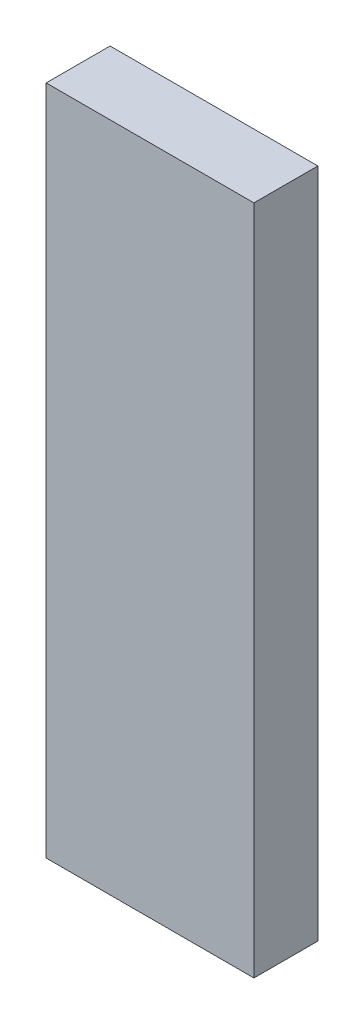
ISO-10303-21;
HEADER;
FILE_DESCRIPTION(('STEP AP214'),'2;1');
FILE_NAME('part.step','',(''),(''),'','','');
FILE_SCHEMA(('AUTOMOTIVE_DESIGN { 1 0 10303 214 1 1 1 1 }'));
ENDSEC;
DATA;
#1=APPLICATION_CONTEXT('core data for automotive mechanical design processes');
#2=APPLICATION_PROTOCOL_DEFINITION('international standard','automotive_design',2000,#1);
#3=PRODUCT_CONTEXT('',#1,'mechanical');
#4=PRODUCT('Part','Part','',(#3));
#5=PRODUCT_RELATED_PRODUCT_CATEGORY('part','',(#4));
#6=PRODUCT_DEFINITION_FORMATION('','',#4);
#7=PRODUCT_DEFINITION_CONTEXT('part definition',#1,'design');
#8=PRODUCT_DEFINITION('design','',#6,#7);
#9=PRODUCT_DEFINITION_SHAPE('','',#8);
#10=(LENGTH_UNIT() NAMED_UNIT(*) SI_UNIT(.MILLI.,.METRE.));
#11=(NAMED_UNIT(*) PLANE_ANGLE_UNIT() SI_UNIT($,.RADIAN.));
#12=(NAMED_UNIT(*) SI_UNIT($,.STERADIAN.) SOLID_ANGLE_UNIT());
#13=UNCERTAINTY_MEASURE_WITH_UNIT(LENGTH_MEASURE(1.E-05),#10,'distance_accuracy_value','');
#14=(GEOMETRIC_REPRESENTATION_CONTEXT(3) GLOBAL_UNCERTAINTY_ASSIGNED_CONTEXT((#13)) GLOBAL_UNIT_ASSIGNED_CONTEXT((#10,
#11,#12)) REPRESENTATION_CONTEXT('',''));
#15=CARTESIAN_POINT('',(0.,0.,0.));
#16=DIRECTION('',(0.,0.,1.));
#17=DIRECTION('',(1.,0.,0.));
#18=AXIS2_PLACEMENT_3D('',#15,#16,#17);
#19=CARTESIAN_POINT('',(32.5,-105.,20.));
#20=DIRECTION('',(-1.,0.,0.));
#21=DIRECTION('',(0.,0.,1.));
#22=AXIS2_PLACEMENT_3D('',#19,#20,#21);
#23=PLANE('',#22);
#24=DIRECTION('',(0.,1.,0.));
#25=VECTOR('',#24,1.);
#26=CARTESIAN_POINT('',(32.5,-105.,0.));
#27=LINE('',#26,#25);
#28=CARTESIAN_POINT('',(32.5,-105.,0.));
#29=VERTEX_POINT('',#28);
#30=CARTESIAN_POINT('',(32.5,105.,0.));
#31=VERTEX_POINT('',#30);
#32=EDGE_CURVE('E100',#29,#31,#27,.T.);
#33=ORIENTED_EDGE('',*,*,#32,.T.);
#34=DIRECTION('',(0.,0.,-1.));
#35=VECTOR('',#34,1.);
#36=CARTESIAN_POINT('',(32.5,105.,20.));
#37=LINE('',#36,#35);
#38=CARTESIAN_POINT('',(32.5,105.,20.));
#39=VERTEX_POINT('',#38);
#40=EDGE_CURVE('E11',#39,#31,#37,.T.);
#41=ORIENTED_EDGE('',*,*,#40,.F.);
#42=DIRECTION('',(0.,1.,0.));
#43=VECTOR('',#42,1.);
#44=CARTESIAN_POINT('',(32.5,-105.,20.));
#45=LINE('',#44,#43);
#46=CARTESIAN_POINT('',(32.5,-105.,20.));
#47=VERTEX_POINT('',#46);
#48=EDGE_CURVE('E88',#47,#39,#45,.T.);
#49=ORIENTED_EDGE('',*,*,#48,.F.);
#50=DIRECTION('',(0.,0.,-1.));
#51=VECTOR('',#50,1.);
#52=CARTESIAN_POINT('',(32.5,-105.,20.));
#53=LINE('',#52,#51);
#54=EDGE_CURVE('E96',#47,#29,#53,.T.);
#55=ORIENTED_EDGE('',*,*,#54,.T.);
#56=EDGE_LOOP('',(#33,#41,#49,#55));
#57=FACE_BOUND('',#56,.T.);
#58=ADVANCED_FACE('F37',(#57),#23,.F.);
#59=CARTESIAN_POINT('',(-32.5,105.,20.));
#60=DIRECTION('',(0.,-1.,0.));
#61=DIRECTION('',(0.,0.,-1.));
#62=AXIS2_PLACEMENT_3D('',#59,#60,#61);
#63=PLANE('',#62);
#64=DIRECTION('',(-1.,0.,0.));
#65=VECTOR('',#64,1.);
#66=CARTESIAN_POINT('',(-32.5,105.,0.));
#67=LINE('',#66,#65);
#68=CARTESIAN_POINT('',(-32.5,105.,0.));
#69=VERTEX_POINT('',#68);
#70=EDGE_CURVE('E92',#31,#69,#67,.T.);
#71=ORIENTED_EDGE('',*,*,#70,.T.);
#72=DIRECTION('',(0.,0.,-1.));
#73=VECTOR('',#72,1.);
#74=CARTESIAN_POINT('',(-32.5,105.,20.));
#75=LINE('',#74,#73);
#76=CARTESIAN_POINT('',(-32.5,105.,20.));
#77=VERTEX_POINT('',#76);
#78=EDGE_CURVE('E45',#77,#69,#75,.T.);
#79=ORIENTED_EDGE('',*,*,#78,.F.);
#80=DIRECTION('',(-1.,0.,0.));
#81=VECTOR('',#80,1.);
#82=CARTESIAN_POINT('',(-32.5,105.,20.));
#83=LINE('',#82,#81);
#84=EDGE_CURVE('E83',#39,#77,#83,.T.);
#85=ORIENTED_EDGE('',*,*,#84,.F.);
#86=ORIENTED_EDGE('',*,*,#40,.T.);
#87=EDGE_LOOP('',(#71,#79,#85,#86));
#88=FACE_BOUND('',#87,.T.);
#89=ADVANCED_FACE('F91',(#88),#63,.F.);
#90=CARTESIAN_POINT('',(-32.5,-105.,20.));
#91=DIRECTION('',(1.,0.,0.));
#92=DIRECTION('',(0.,0.,-1.));
#93=AXIS2_PLACEMENT_3D('',#90,#91,#92);
#94=PLANE('',#93);
#95=DIRECTION('',(0.,-1.,0.));
#96=VECTOR('',#95,1.);
#97=CARTESIAN_POINT('',(-32.5,-105.,0.));
#98=LINE('',#97,#96);
#99=CARTESIAN_POINT('',(-32.5,-105.,0.));
#100=VERTEX_POINT('',#99);
#101=EDGE_CURVE('E70',#69,#100,#98,.T.);
#102=ORIENTED_EDGE('',*,*,#101,.T.);
#103=DIRECTION('',(0.,0.,-1.));
#104=VECTOR('',#103,1.);
#105=CARTESIAN_POINT('',(-32.5,-105.,20.));
#106=LINE('',#105,#104);
#107=CARTESIAN_POINT('',(-32.5,-105.,20.));
#108=VERTEX_POINT('',#107);
#109=EDGE_CURVE('E93',#108,#100,#106,.T.);
#110=ORIENTED_EDGE('',*,*,#109,.F.);
#111=DIRECTION('',(0.,-1.,0.));
#112=VECTOR('',#111,1.);
#113=CARTESIAN_POINT('',(-32.5,-105.,20.));
#114=LINE('',#113,#112);
#115=EDGE_CURVE('E86',#77,#108,#114,.T.);
#116=ORIENTED_EDGE('',*,*,#115,.F.);
#117=ORIENTED_EDGE('',*,*,#78,.T.);
#118=EDGE_LOOP('',(#102,#110,#116,#117));
#119=FACE_BOUND('',#118,.T.);
#120=ADVANCED_FACE('F94',(#119),#94,.F.);
#121=CARTESIAN_POINT('',(-32.5,-105.,20.));
#122=DIRECTION('',(0.,1.,0.));
#123=DIRECTION('',(0.,0.,1.));
#124=AXIS2_PLACEMENT_3D('',#121,#122,#123);
#125=PLANE('',#124);
#126=DIRECTION('',(1.,0.,0.));
#127=VECTOR('',#126,1.);
#128=CARTESIAN_POINT('',(-32.5,-105.,0.));
#129=LINE('',#128,#127);
#130=EDGE_CURVE('E76',#100,#29,#129,.T.);
#131=ORIENTED_EDGE('',*,*,#130,.T.);
#132=ORIENTED_EDGE('',*,*,#54,.F.);
#133=DIRECTION('',(1.,0.,0.));
#134=VECTOR('',#133,1.);
#135=CARTESIAN_POINT('',(-32.5,-105.,20.));
#136=LINE('',#135,#134);
#137=EDGE_CURVE('E53',#108,#47,#136,.T.);
#138=ORIENTED_EDGE('',*,*,#137,.F.);
#139=ORIENTED_EDGE('',*,*,#109,.T.);
#140=EDGE_LOOP('',(#131,#132,#138,#139));
#141=FACE_BOUND('',#140,.T.);
#142=ADVANCED_FACE('F107',(#141),#125,.F.);
#143=CARTESIAN_POINT('',(0.,0.,20.));
#144=DIRECTION('',(0.,0.,-1.));
#145=DIRECTION('',(-1.,0.,0.));
#146=AXIS2_PLACEMENT_3D('',#143,#144,#145);
#147=PLANE('',#146);
#148=ORIENTED_EDGE('',*,*,#48,.T.);
#149=ORIENTED_EDGE('',*,*,#84,.T.);
#150=ORIENTED_EDGE('',*,*,#115,.T.);
#151=ORIENTED_EDGE('',*,*,#137,.T.);
#152=EDGE_LOOP('',(#148,#149,#150,#151));
#153=FACE_BOUND('',#152,.T.);
#154=ADVANCED_FACE('F84',(#153),#147,.F.);
#155=CARTESIAN_POINT('',(0.,0.,0.));
#156=DIRECTION('',(0.,0.,-1.));
#157=DIRECTION('',(-1.,0.,0.));
#158=AXIS2_PLACEMENT_3D('',#155,#156,#157);
#159=PLANE('',#158);
#160=ORIENTED_EDGE('',*,*,#32,.F.);
#161=ORIENTED_EDGE('',*,*,#130,.F.);
#162=ORIENTED_EDGE('',*,*,#101,.F.);
#163=ORIENTED_EDGE('',*,*,#70,.F.);
#164=EDGE_LOOP('',(#160,#161,#162,#163));
#165=FACE_BOUND('',#164,.T.);
#166=ADVANCED_FACE('F110',(#165),#159,.T.);
#167=CLOSED_SHELL('',(#58,#89,#120,#142,#154,#166));
#168=MANIFOLD_SOLID_BREP('B2',#167);
#169=ADVANCED_BREP_SHAPE_REPRESENTATION('',(#18,#168),#14);
#170=SHAPE_DEFINITION_REPRESENTATION(#9,#169);
ENDSEC;
END-ISO-10303-21;
